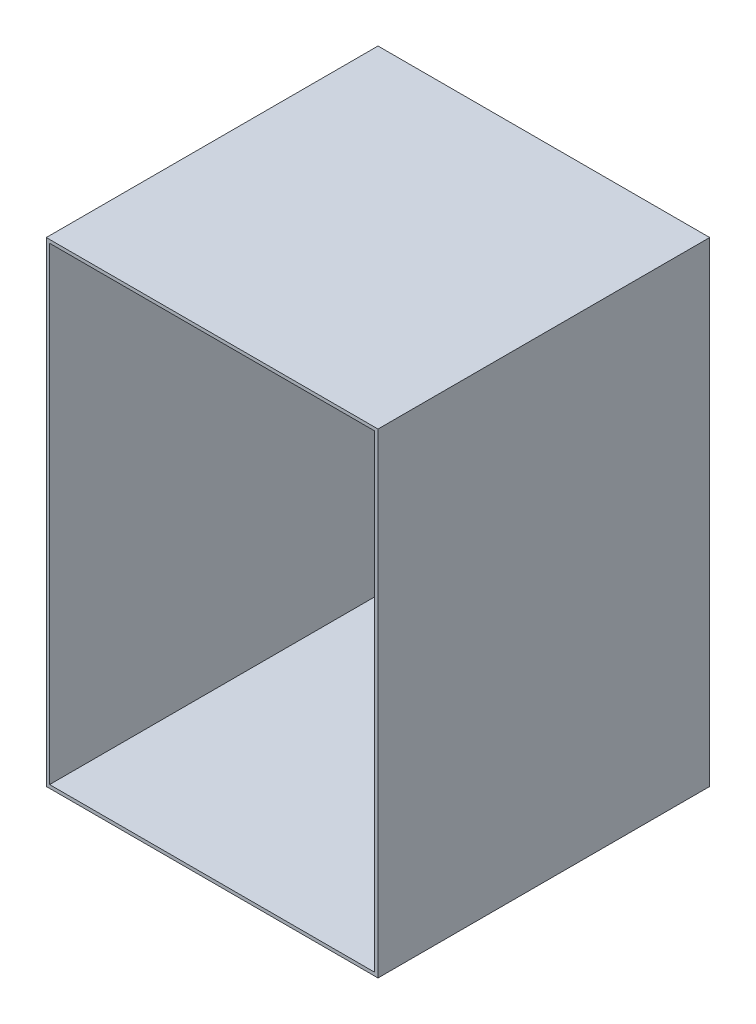
ISO-10303-21;
HEADER;
FILE_DESCRIPTION(('STEP AP214'),'2;1');
FILE_NAME('part.step','',(''),(''),'','','');
FILE_SCHEMA(('AUTOMOTIVE_DESIGN { 1 0 10303 214 1 1 1 1 }'));
ENDSEC;
DATA;
#1=APPLICATION_CONTEXT('core data for automotive mechanical design processes');
#2=APPLICATION_PROTOCOL_DEFINITION('international standard','automotive_design',2000,#1);
#3=PRODUCT_CONTEXT('',#1,'mechanical');
#4=PRODUCT('Part','Part','',(#3));
#5=PRODUCT_RELATED_PRODUCT_CATEGORY('part','',(#4));
#6=PRODUCT_DEFINITION_FORMATION('','',#4);
#7=PRODUCT_DEFINITION_CONTEXT('part definition',#1,'design');
#8=PRODUCT_DEFINITION('design','',#6,#7);
#9=PRODUCT_DEFINITION_SHAPE('','',#8);
#10=(LENGTH_UNIT() NAMED_UNIT(*) SI_UNIT(.MILLI.,.METRE.));
#11=(NAMED_UNIT(*) PLANE_ANGLE_UNIT() SI_UNIT($,.RADIAN.));
#12=(NAMED_UNIT(*) SI_UNIT($,.STERADIAN.) SOLID_ANGLE_UNIT());
#13=UNCERTAINTY_MEASURE_WITH_UNIT(LENGTH_MEASURE(1.E-05),#10,'distance_accuracy_value','');
#14=(GEOMETRIC_REPRESENTATION_CONTEXT(3) GLOBAL_UNCERTAINTY_ASSIGNED_CONTEXT((#13)) GLOBAL_UNIT_ASSIGNED_CONTEXT((#10,
#11,#12)) REPRESENTATION_CONTEXT('',''));
#15=CARTESIAN_POINT('',(0.,0.,0.));
#16=DIRECTION('',(0.,0.,1.));
#17=DIRECTION('',(1.,0.,0.));
#18=AXIS2_PLACEMENT_3D('',#15,#16,#17);
#19=CARTESIAN_POINT('',(0.,0.,-300.));
#20=DIRECTION('',(-1.,0.,0.));
#21=DIRECTION('',(0.,0.,1.));
#22=AXIS2_PLACEMENT_3D('',#19,#20,#21);
#23=PLANE('',#22);
#24=DIRECTION('',(0.,-1.,0.));
#25=VECTOR('',#24,1.);
#26=CARTESIAN_POINT('',(0.,0.,0.));
#27=LINE('',#26,#25);
#28=CARTESIAN_POINT('',(0.,430.,0.));
#29=VERTEX_POINT('',#28);
#30=CARTESIAN_POINT('',(0.,0.,0.));
#31=VERTEX_POINT('',#30);
#32=EDGE_CURVE('E139',#29,#31,#27,.T.);
#33=ORIENTED_EDGE('',*,*,#32,.F.);
#34=DIRECTION('',(0.,0.,1.));
#35=VECTOR('',#34,1.);
#36=CARTESIAN_POINT('',(0.,430.,-300.));
#37=LINE('',#36,#35);
#38=CARTESIAN_POINT('',(0.,430.,-300.));
#39=VERTEX_POINT('',#38);
#40=EDGE_CURVE('E11',#39,#29,#37,.T.);
#41=ORIENTED_EDGE('',*,*,#40,.F.);
#42=DIRECTION('',(0.,-1.,0.));
#43=VECTOR('',#42,1.);
#44=CARTESIAN_POINT('',(0.,0.,-300.));
#45=LINE('',#44,#43);
#46=CARTESIAN_POINT('',(0.,0.,-300.));
#47=VERTEX_POINT('',#46);
#48=EDGE_CURVE('E143',#39,#47,#45,.T.);
#49=ORIENTED_EDGE('',*,*,#48,.T.);
#50=DIRECTION('',(0.,0.,1.));
#51=VECTOR('',#50,1.);
#52=CARTESIAN_POINT('',(0.,0.,-300.));
#53=LINE('',#52,#51);
#54=EDGE_CURVE('E35',#47,#31,#53,.T.);
#55=ORIENTED_EDGE('',*,*,#54,.T.);
#56=EDGE_LOOP('',(#33,#41,#49,#55));
#57=FACE_BOUND('',#56,.T.);
#58=ADVANCED_FACE('F32',(#57),#23,.T.);
#59=CARTESIAN_POINT('',(0.,430.,-300.));
#60=DIRECTION('',(0.,1.,0.));
#61=DIRECTION('',(0.,0.,1.));
#62=AXIS2_PLACEMENT_3D('',#59,#60,#61);
#63=PLANE('',#62);
#64=DIRECTION('',(-1.,0.,0.));
#65=VECTOR('',#64,1.);
#66=CARTESIAN_POINT('',(0.,430.,0.));
#67=LINE('',#66,#65);
#68=CARTESIAN_POINT('',(300.,430.,0.));
#69=VERTEX_POINT('',#68);
#70=EDGE_CURVE('E146',#69,#29,#67,.T.);
#71=ORIENTED_EDGE('',*,*,#70,.F.);
#72=DIRECTION('',(0.,0.,1.));
#73=VECTOR('',#72,1.);
#74=CARTESIAN_POINT('',(300.,430.,-300.));
#75=LINE('',#74,#73);
#76=CARTESIAN_POINT('',(300.,430.,-300.));
#77=VERTEX_POINT('',#76);
#78=EDGE_CURVE('E40',#77,#69,#75,.T.);
#79=ORIENTED_EDGE('',*,*,#78,.F.);
#80=DIRECTION('',(-1.,0.,0.));
#81=VECTOR('',#80,1.);
#82=CARTESIAN_POINT('',(0.,430.,-300.));
#83=LINE('',#82,#81);
#84=EDGE_CURVE('E151',#77,#39,#83,.T.);
#85=ORIENTED_EDGE('',*,*,#84,.T.);
#86=ORIENTED_EDGE('',*,*,#40,.T.);
#87=EDGE_LOOP('',(#71,#79,#85,#86));
#88=FACE_BOUND('',#87,.T.);
#89=ADVANCED_FACE('F168',(#88),#63,.T.);
#90=CARTESIAN_POINT('',(300.,0.,-300.));
#91=DIRECTION('',(1.,0.,0.));
#92=DIRECTION('',(0.,0.,-1.));
#93=AXIS2_PLACEMENT_3D('',#90,#91,#92);
#94=PLANE('',#93);
#95=DIRECTION('',(0.,1.,0.));
#96=VECTOR('',#95,1.);
#97=CARTESIAN_POINT('',(300.,0.,0.));
#98=LINE('',#97,#96);
#99=CARTESIAN_POINT('',(300.,0.,0.));
#100=VERTEX_POINT('',#99);
#101=EDGE_CURVE('E158',#100,#69,#98,.T.);
#102=ORIENTED_EDGE('',*,*,#101,.F.);
#103=DIRECTION('',(0.,0.,1.));
#104=VECTOR('',#103,1.);
#105=CARTESIAN_POINT('',(300.,0.,-300.));
#106=LINE('',#105,#104);
#107=CARTESIAN_POINT('',(300.,0.,-300.));
#108=VERTEX_POINT('',#107);
#109=EDGE_CURVE('E163',#108,#100,#106,.T.);
#110=ORIENTED_EDGE('',*,*,#109,.F.);
#111=DIRECTION('',(0.,1.,0.));
#112=VECTOR('',#111,1.);
#113=CARTESIAN_POINT('',(300.,0.,-300.));
#114=LINE('',#113,#112);
#115=EDGE_CURVE('E148',#108,#77,#114,.T.);
#116=ORIENTED_EDGE('',*,*,#115,.T.);
#117=ORIENTED_EDGE('',*,*,#78,.T.);
#118=EDGE_LOOP('',(#102,#110,#116,#117));
#119=FACE_BOUND('',#118,.T.);
#120=ADVANCED_FACE('F172',(#119),#94,.T.);
#121=CARTESIAN_POINT('',(0.,0.,-300.));
#122=DIRECTION('',(0.,-1.,0.));
#123=DIRECTION('',(0.,0.,-1.));
#124=AXIS2_PLACEMENT_3D('',#121,#122,#123);
#125=PLANE('',#124);
#126=DIRECTION('',(1.,0.,0.));
#127=VECTOR('',#126,1.);
#128=CARTESIAN_POINT('',(0.,0.,0.));
#129=LINE('',#128,#127);
#130=EDGE_CURVE('E155',#31,#100,#129,.T.);
#131=ORIENTED_EDGE('',*,*,#130,.F.);
#132=ORIENTED_EDGE('',*,*,#54,.F.);
#133=DIRECTION('',(1.,0.,0.));
#134=VECTOR('',#133,1.);
#135=CARTESIAN_POINT('',(0.,0.,-300.));
#136=LINE('',#135,#134);
#137=EDGE_CURVE('E145',#47,#108,#136,.T.);
#138=ORIENTED_EDGE('',*,*,#137,.T.);
#139=ORIENTED_EDGE('',*,*,#109,.T.);
#140=EDGE_LOOP('',(#131,#132,#138,#139));
#141=FACE_BOUND('',#140,.T.);
#142=ADVANCED_FACE('F165',(#141),#125,.T.);
#143=CARTESIAN_POINT('',(0.,0.,-300.));
#144=DIRECTION('',(0.,0.,-1.));
#145=DIRECTION('',(-1.,0.,0.));
#146=AXIS2_PLACEMENT_3D('',#143,#144,#145);
#147=PLANE('',#146);
#148=ORIENTED_EDGE('',*,*,#48,.F.);
#149=ORIENTED_EDGE('',*,*,#84,.F.);
#150=ORIENTED_EDGE('',*,*,#115,.F.);
#151=ORIENTED_EDGE('',*,*,#137,.F.);
#152=EDGE_LOOP('',(#148,#149,#150,#151));
#153=FACE_BOUND('',#152,.T.);
#154=ADVANCED_FACE('F174',(#153),#147,.T.);
#155=CARTESIAN_POINT('',(0.,0.,0.));
#156=DIRECTION('',(0.,0.,-1.));
#157=DIRECTION('',(-1.,0.,0.));
#158=AXIS2_PLACEMENT_3D('',#155,#156,#157);
#159=PLANE('',#158);
#160=DIRECTION('',(1.,0.,0.));
#161=VECTOR('',#160,1.);
#162=CARTESIAN_POINT('',(3.,3.,0.));
#163=LINE('',#162,#161);
#164=CARTESIAN_POINT('',(3.,3.,0.));
#165=VERTEX_POINT('',#164);
#166=CARTESIAN_POINT('',(297.,3.,0.));
#167=VERTEX_POINT('',#166);
#168=EDGE_CURVE('E133',#165,#167,#163,.T.);
#169=ORIENTED_EDGE('',*,*,#168,.F.);
#170=DIRECTION('',(0.,-1.,0.));
#171=VECTOR('',#170,1.);
#172=CARTESIAN_POINT('',(3.,427.,0.));
#173=LINE('',#172,#171);
#174=CARTESIAN_POINT('',(3.,427.,0.));
#175=VERTEX_POINT('',#174);
#176=EDGE_CURVE('E48',#175,#165,#173,.T.);
#177=ORIENTED_EDGE('',*,*,#176,.F.);
#178=DIRECTION('',(-1.,0.,0.));
#179=VECTOR('',#178,1.);
#180=CARTESIAN_POINT('',(297.,427.,0.));
#181=LINE('',#180,#179);
#182=CARTESIAN_POINT('',(297.,427.,0.));
#183=VERTEX_POINT('',#182);
#184=EDGE_CURVE('E124',#183,#175,#181,.T.);
#185=ORIENTED_EDGE('',*,*,#184,.F.);
#186=DIRECTION('',(0.,1.,0.));
#187=VECTOR('',#186,1.);
#188=CARTESIAN_POINT('',(297.,3.,0.));
#189=LINE('',#188,#187);
#190=EDGE_CURVE('E127',#167,#183,#189,.T.);
#191=ORIENTED_EDGE('',*,*,#190,.F.);
#192=EDGE_LOOP('',(#169,#177,#185,#191));
#193=FACE_BOUND('',#192,.T.);
#194=ORIENTED_EDGE('',*,*,#32,.T.);
#195=ORIENTED_EDGE('',*,*,#130,.T.);
#196=ORIENTED_EDGE('',*,*,#101,.T.);
#197=ORIENTED_EDGE('',*,*,#70,.T.);
#198=EDGE_LOOP('',(#194,#195,#196,#197));
#199=FACE_BOUND('',#198,.T.);
#200=ADVANCED_FACE('F167',(#193,#199),#159,.F.);
#201=CARTESIAN_POINT('',(3.,427.,-297.));
#202=DIRECTION('',(-1.,0.,0.));
#203=DIRECTION('',(0.,0.,1.));
#204=AXIS2_PLACEMENT_3D('',#201,#202,#203);
#205=PLANE('',#204);
#206=ORIENTED_EDGE('',*,*,#176,.T.);
#207=DIRECTION('',(0.,0.,1.));
#208=VECTOR('',#207,1.);
#209=CARTESIAN_POINT('',(3.,3.,-297.));
#210=LINE('',#209,#208);
#211=CARTESIAN_POINT('',(3.,3.,-297.));
#212=VERTEX_POINT('',#211);
#213=EDGE_CURVE('E102',#212,#165,#210,.T.);
#214=ORIENTED_EDGE('',*,*,#213,.F.);
#215=DIRECTION('',(0.,-1.,0.));
#216=VECTOR('',#215,1.);
#217=CARTESIAN_POINT('',(3.,427.,-297.));
#218=LINE('',#217,#216);
#219=CARTESIAN_POINT('',(3.,427.,-297.));
#220=VERTEX_POINT('',#219);
#221=EDGE_CURVE('E106',#220,#212,#218,.T.);
#222=ORIENTED_EDGE('',*,*,#221,.F.);
#223=DIRECTION('',(0.,0.,1.));
#224=VECTOR('',#223,1.);
#225=CARTESIAN_POINT('',(3.,427.,-297.));
#226=LINE('',#225,#224);
#227=EDGE_CURVE('E137',#220,#175,#226,.T.);
#228=ORIENTED_EDGE('',*,*,#227,.T.);
#229=EDGE_LOOP('',(#206,#214,#222,#228));
#230=FACE_BOUND('',#229,.T.);
#231=ADVANCED_FACE('F104',(#230),#205,.F.);
#232=CARTESIAN_POINT('',(297.,427.,-297.));
#233=DIRECTION('',(0.,1.,0.));
#234=DIRECTION('',(0.,0.,1.));
#235=AXIS2_PLACEMENT_3D('',#232,#233,#234);
#236=PLANE('',#235);
#237=ORIENTED_EDGE('',*,*,#184,.T.);
#238=ORIENTED_EDGE('',*,*,#227,.F.);
#239=DIRECTION('',(-1.,0.,0.));
#240=VECTOR('',#239,1.);
#241=CARTESIAN_POINT('',(297.,427.,-297.));
#242=LINE('',#241,#240);
#243=CARTESIAN_POINT('',(297.,427.,-297.));
#244=VERTEX_POINT('',#243);
#245=EDGE_CURVE('E112',#244,#220,#242,.T.);
#246=ORIENTED_EDGE('',*,*,#245,.F.);
#247=DIRECTION('',(0.,0.,1.));
#248=VECTOR('',#247,1.);
#249=CARTESIAN_POINT('',(297.,427.,-297.));
#250=LINE('',#249,#248);
#251=EDGE_CURVE('E140',#244,#183,#250,.T.);
#252=ORIENTED_EDGE('',*,*,#251,.T.);
#253=EDGE_LOOP('',(#237,#238,#246,#252));
#254=FACE_BOUND('',#253,.T.);
#255=ADVANCED_FACE('F218',(#254),#236,.F.);
#256=CARTESIAN_POINT('',(297.,3.,-297.));
#257=DIRECTION('',(1.,0.,0.));
#258=DIRECTION('',(0.,0.,-1.));
#259=AXIS2_PLACEMENT_3D('',#256,#257,#258);
#260=PLANE('',#259);
#261=ORIENTED_EDGE('',*,*,#190,.T.);
#262=ORIENTED_EDGE('',*,*,#251,.F.);
#263=DIRECTION('',(0.,1.,0.));
#264=VECTOR('',#263,1.);
#265=CARTESIAN_POINT('',(297.,3.,-297.));
#266=LINE('',#265,#264);
#267=CARTESIAN_POINT('',(297.,3.,-297.));
#268=VERTEX_POINT('',#267);
#269=EDGE_CURVE('E120',#268,#244,#266,.T.);
#270=ORIENTED_EDGE('',*,*,#269,.F.);
#271=DIRECTION('',(0.,0.,1.));
#272=VECTOR('',#271,1.);
#273=CARTESIAN_POINT('',(297.,3.,-297.));
#274=LINE('',#273,#272);
#275=EDGE_CURVE('E111',#268,#167,#274,.T.);
#276=ORIENTED_EDGE('',*,*,#275,.T.);
#277=EDGE_LOOP('',(#261,#262,#270,#276));
#278=FACE_BOUND('',#277,.T.);
#279=ADVANCED_FACE('F226',(#278),#260,.F.);
#280=CARTESIAN_POINT('',(3.,3.,-297.));
#281=DIRECTION('',(0.,-1.,0.));
#282=DIRECTION('',(0.,0.,-1.));
#283=AXIS2_PLACEMENT_3D('',#280,#281,#282);
#284=PLANE('',#283);
#285=ORIENTED_EDGE('',*,*,#168,.T.);
#286=ORIENTED_EDGE('',*,*,#275,.F.);
#287=DIRECTION('',(1.,0.,0.));
#288=VECTOR('',#287,1.);
#289=CARTESIAN_POINT('',(3.,3.,-297.));
#290=LINE('',#289,#288);
#291=EDGE_CURVE('E115',#212,#268,#290,.T.);
#292=ORIENTED_EDGE('',*,*,#291,.F.);
#293=ORIENTED_EDGE('',*,*,#213,.T.);
#294=EDGE_LOOP('',(#285,#286,#292,#293));
#295=FACE_BOUND('',#294,.T.);
#296=ADVANCED_FACE('F116',(#295),#284,.F.);
#297=CARTESIAN_POINT('',(0.,0.,-297.));
#298=DIRECTION('',(0.,0.,1.));
#299=DIRECTION('',(1.,0.,0.));
#300=AXIS2_PLACEMENT_3D('',#297,#298,#299);
#301=PLANE('',#300);
#302=ORIENTED_EDGE('',*,*,#221,.T.);
#303=ORIENTED_EDGE('',*,*,#291,.T.);
#304=ORIENTED_EDGE('',*,*,#269,.T.);
#305=ORIENTED_EDGE('',*,*,#245,.T.);
#306=EDGE_LOOP('',(#302,#303,#304,#305));
#307=FACE_BOUND('',#306,.T.);
#308=ADVANCED_FACE('F122',(#307),#301,.T.);
#309=CLOSED_SHELL('',(#58,#89,#120,#142,#154,#200,#231,#255,#279,#296,#308));
#310=MANIFOLD_SOLID_BREP('B2',#309);
#311=ADVANCED_BREP_SHAPE_REPRESENTATION('',(#18,#310),#14);
#312=SHAPE_DEFINITION_REPRESENTATION(#9,#311);
ENDSEC;
END-ISO-10303-21;
